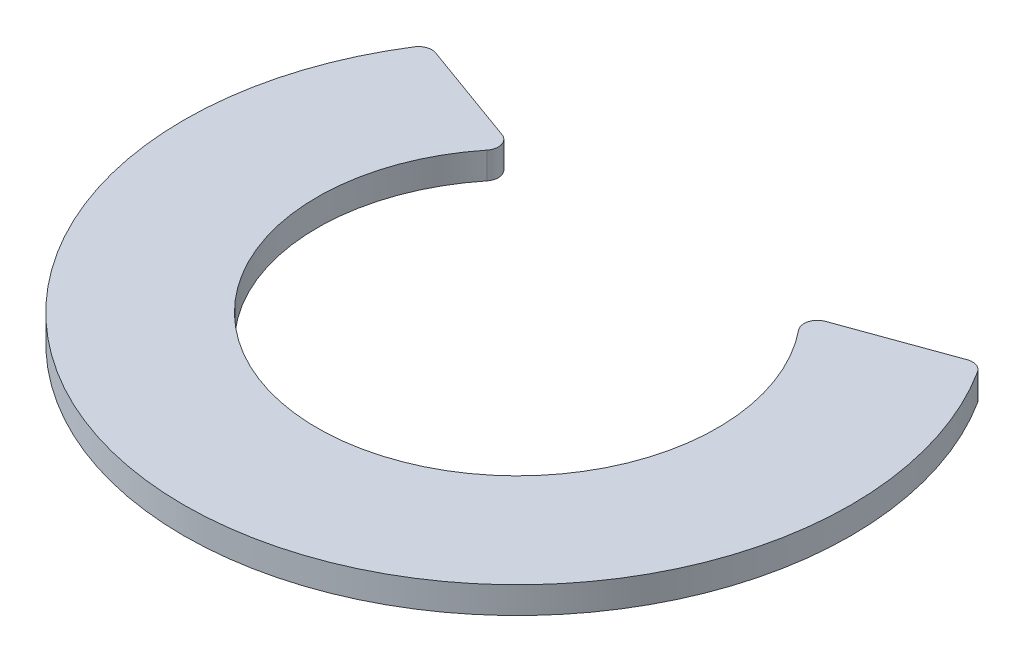
ISO-10303-21;
HEADER;
FILE_DESCRIPTION(('STEP AP214'),'2;1');
FILE_NAME('part.step','',(''),(''),'','','');
FILE_SCHEMA(('AUTOMOTIVE_DESIGN { 1 0 10303 214 1 1 1 1 }'));
ENDSEC;
DATA;
#1=APPLICATION_CONTEXT('core data for automotive mechanical design processes');
#2=APPLICATION_PROTOCOL_DEFINITION('international standard','automotive_design',2000,#1);
#3=PRODUCT_CONTEXT('',#1,'mechanical');
#4=PRODUCT('Part','Part','',(#3));
#5=PRODUCT_RELATED_PRODUCT_CATEGORY('part','',(#4));
#6=PRODUCT_DEFINITION_FORMATION('','',#4);
#7=PRODUCT_DEFINITION_CONTEXT('part definition',#1,'design');
#8=PRODUCT_DEFINITION('design','',#6,#7);
#9=PRODUCT_DEFINITION_SHAPE('','',#8);
#10=(LENGTH_UNIT() NAMED_UNIT(*) SI_UNIT(.MILLI.,.METRE.));
#11=(NAMED_UNIT(*) PLANE_ANGLE_UNIT() SI_UNIT($,.RADIAN.));
#12=(NAMED_UNIT(*) SI_UNIT($,.STERADIAN.) SOLID_ANGLE_UNIT());
#13=UNCERTAINTY_MEASURE_WITH_UNIT(LENGTH_MEASURE(1.E-05),#10,'distance_accuracy_value','');
#14=(GEOMETRIC_REPRESENTATION_CONTEXT(3) GLOBAL_UNCERTAINTY_ASSIGNED_CONTEXT((#13)) GLOBAL_UNIT_ASSIGNED_CONTEXT((#10,
#11,#12)) REPRESENTATION_CONTEXT('',''));
#15=CARTESIAN_POINT('',(0.,0.,0.));
#16=DIRECTION('',(0.,0.,1.));
#17=DIRECTION('',(1.,0.,0.));
#18=AXIS2_PLACEMENT_3D('',#15,#16,#17);
#19=CARTESIAN_POINT('',(2.02653906521966,0.2,-1.28574469360703));
#20=DIRECTION('',(0.,-1.,0.));
#21=DIRECTION('',(0.,0.,-1.));
#22=AXIS2_PLACEMENT_3D('',#19,#20,#21);
#23=CYLINDRICAL_SURFACE('',#22,0.0999999999999998);
#24=CARTESIAN_POINT('',(2.02653906521966,0.,-1.28574469360703));
#25=DIRECTION('',(0.,1.,0.));
#26=DIRECTION('',(0.,0.,1.));
#27=AXIS2_PLACEMENT_3D('',#24,#25,#26);
#28=CIRCLE('',#27,0.0999999999999998);
#29=CARTESIAN_POINT('',(2.11097819293715,0.,-1.33931738917399));
#30=VERTEX_POINT('',#29);
#31=CARTESIAN_POINT('',(1.99252463426726,0.,-1.37978201857421));
#32=VERTEX_POINT('',#31);
#33=EDGE_CURVE('E129',#30,#32,#28,.T.);
#34=ORIENTED_EDGE('',*,*,#33,.T.);
#35=DIRECTION('',(0.,-1.,0.));
#36=VECTOR('',#35,1.);
#37=CARTESIAN_POINT('',(1.99252463426726,0.2,-1.37978201857421));
#38=LINE('',#37,#36);
#39=CARTESIAN_POINT('',(1.99252463426726,0.2,-1.37978201857421));
#40=VERTEX_POINT('',#39);
#41=EDGE_CURVE('E11',#40,#32,#38,.T.);
#42=ORIENTED_EDGE('',*,*,#41,.F.);
#43=CARTESIAN_POINT('',(2.02653906521966,0.2,-1.28574469360703));
#44=DIRECTION('',(0.,1.,0.));
#45=DIRECTION('',(0.,0.,1.));
#46=AXIS2_PLACEMENT_3D('',#43,#44,#45);
#47=CIRCLE('',#46,0.0999999999999998);
#48=CARTESIAN_POINT('',(2.11097819293715,0.2,-1.33931738917399));
#49=VERTEX_POINT('',#48);
#50=EDGE_CURVE('E143',#49,#40,#47,.T.);
#51=ORIENTED_EDGE('',*,*,#50,.F.);
#52=DIRECTION('',(0.,-1.,0.));
#53=VECTOR('',#52,1.);
#54=CARTESIAN_POINT('',(2.11097819293715,0.2,-1.33931738917399));
#55=LINE('',#54,#53);
#56=EDGE_CURVE('E125',#49,#30,#55,.T.);
#57=ORIENTED_EDGE('',*,*,#56,.T.);
#58=EDGE_LOOP('',(#34,#42,#51,#57));
#59=FACE_BOUND('',#58,.T.);
#60=ADVANCED_FACE('F33',(#59),#23,.T.);
#61=CARTESIAN_POINT('',(1.21218558709129,0.2,-1.09752400401574));
#62=DIRECTION('',(0.340144309523994,0.,0.940373249671876));
#63=DIRECTION('',(0.940373249671877,0.,-0.340144309523994));
#64=AXIS2_PLACEMENT_3D('',#61,#62,#63);
#65=PLANE('',#64);
#66=DIRECTION('',(-0.940373249671876,0.,0.340144309523994));
#67=VECTOR('',#66,1.);
#68=CARTESIAN_POINT('',(1.21218558709129,0.,-1.09752400401574));
#69=LINE('',#68,#67);
#70=CARTESIAN_POINT('',(1.21218558709129,0.,-1.09752400401574));
#71=VERTEX_POINT('',#70);
#72=EDGE_CURVE('E132',#32,#71,#69,.T.);
#73=ORIENTED_EDGE('',*,*,#72,.T.);
#74=DIRECTION('',(0.,-1.,0.));
#75=VECTOR('',#74,1.);
#76=CARTESIAN_POINT('',(1.21218558709129,0.2,-1.09752400401574));
#77=LINE('',#76,#75);
#78=CARTESIAN_POINT('',(1.21218558709129,0.2,-1.09752400401574));
#79=VERTEX_POINT('',#78);
#80=EDGE_CURVE('E41',#79,#71,#77,.T.);
#81=ORIENTED_EDGE('',*,*,#80,.F.);
#82=DIRECTION('',(-0.940373249671876,0.,0.340144309523994));
#83=VECTOR('',#82,1.);
#84=CARTESIAN_POINT('',(1.21218558709129,0.2,-1.09752400401574));
#85=LINE('',#84,#83);
#86=EDGE_CURVE('E92',#40,#79,#85,.T.);
#87=ORIENTED_EDGE('',*,*,#86,.F.);
#88=ORIENTED_EDGE('',*,*,#41,.T.);
#89=EDGE_LOOP('',(#73,#81,#87,#88));
#90=FACE_BOUND('',#89,.T.);
#91=ADVANCED_FACE('F178',(#90),#65,.F.);
#92=CARTESIAN_POINT('',(1.24620001804369,0.2,-1.00348667904856));
#93=DIRECTION('',(0.,-1.,0.));
#94=DIRECTION('',(0.,0.,-1.));
#95=AXIS2_PLACEMENT_3D('',#92,#93,#94);
#96=CYLINDRICAL_SURFACE('',#95,0.0999999999999999);
#97=CARTESIAN_POINT('',(1.24620001804369,0.,-1.00348667904856));
#98=DIRECTION('',(0.,1.,0.));
#99=DIRECTION('',(0.,0.,-1.));
#100=AXIS2_PLACEMENT_3D('',#97,#98,#99);
#101=CIRCLE('',#100,0.0999999999999999);
#102=CARTESIAN_POINT('',(1.16831251691596,0.,-0.940768761608021));
#103=VERTEX_POINT('',#102);
#104=EDGE_CURVE('E134',#71,#103,#101,.T.);
#105=ORIENTED_EDGE('',*,*,#104,.T.);
#106=DIRECTION('',(0.,-1.,0.));
#107=VECTOR('',#106,1.);
#108=CARTESIAN_POINT('',(1.16831251691596,0.2,-0.940768761608021));
#109=LINE('',#108,#107);
#110=CARTESIAN_POINT('',(1.16831251691596,0.2,-0.940768761608021));
#111=VERTEX_POINT('',#110);
#112=EDGE_CURVE('E150',#111,#103,#109,.T.);
#113=ORIENTED_EDGE('',*,*,#112,.F.);
#114=CARTESIAN_POINT('',(1.24620001804369,0.2,-1.00348667904856));
#115=DIRECTION('',(0.,1.,0.));
#116=DIRECTION('',(0.,0.,-1.));
#117=AXIS2_PLACEMENT_3D('',#114,#115,#116);
#118=CIRCLE('',#117,0.0999999999999999);
#119=EDGE_CURVE('E158',#79,#111,#118,.T.);
#120=ORIENTED_EDGE('',*,*,#119,.F.);
#121=ORIENTED_EDGE('',*,*,#80,.T.);
#122=EDGE_LOOP('',(#105,#113,#120,#121));
#123=FACE_BOUND('',#122,.T.);
#124=ADVANCED_FACE('F156',(#123),#96,.T.);
#125=CARTESIAN_POINT('',(0.,0.2,0.));
#126=DIRECTION('',(0.,-1.,0.));
#127=DIRECTION('',(0.,0.,-1.));
#128=AXIS2_PLACEMENT_3D('',#125,#126,#127);
#129=CYLINDRICAL_SURFACE('',#128,1.5);
#130=CARTESIAN_POINT('',(0.,0.,0.));
#131=DIRECTION('',(0.,-1.,0.));
#132=DIRECTION('',(0.,0.,1.));
#133=AXIS2_PLACEMENT_3D('',#130,#131,#132);
#134=CIRCLE('',#133,1.5);
#135=CARTESIAN_POINT('',(-1.16831251691596,0.,-0.940768761608022));
#136=VERTEX_POINT('',#135);
#137=EDGE_CURVE('E136',#103,#136,#134,.T.);
#138=ORIENTED_EDGE('',*,*,#137,.T.);
#139=DIRECTION('',(0.,-1.,0.));
#140=VECTOR('',#139,1.);
#141=CARTESIAN_POINT('',(-1.16831251691596,0.2,-0.940768761608022));
#142=LINE('',#141,#140);
#143=CARTESIAN_POINT('',(-1.16831251691596,0.2,-0.940768761608022));
#144=VERTEX_POINT('',#143);
#145=EDGE_CURVE('E147',#144,#136,#142,.T.);
#146=ORIENTED_EDGE('',*,*,#145,.F.);
#147=CARTESIAN_POINT('',(0.,0.2,0.));
#148=DIRECTION('',(0.,-1.,0.));
#149=DIRECTION('',(0.,0.,1.));
#150=AXIS2_PLACEMENT_3D('',#147,#148,#149);
#151=CIRCLE('',#150,1.5);
#152=EDGE_CURVE('E170',#111,#144,#151,.T.);
#153=ORIENTED_EDGE('',*,*,#152,.F.);
#154=ORIENTED_EDGE('',*,*,#112,.T.);
#155=EDGE_LOOP('',(#138,#146,#153,#154));
#156=FACE_BOUND('',#155,.T.);
#157=ADVANCED_FACE('F166',(#156),#129,.F.);
#158=CARTESIAN_POINT('',(-1.24620001804369,0.2,-1.00348667904856));
#159=DIRECTION('',(0.,-1.,0.));
#160=DIRECTION('',(0.,0.,-1.));
#161=AXIS2_PLACEMENT_3D('',#158,#159,#160);
#162=CYLINDRICAL_SURFACE('',#161,0.1);
#163=CARTESIAN_POINT('',(-1.24620001804369,0.,-1.00348667904856));
#164=DIRECTION('',(0.,1.,0.));
#165=DIRECTION('',(0.,0.,1.));
#166=AXIS2_PLACEMENT_3D('',#163,#164,#165);
#167=CIRCLE('',#166,0.1);
#168=CARTESIAN_POINT('',(-1.21218558709129,0.,-1.09752400401574));
#169=VERTEX_POINT('',#168);
#170=EDGE_CURVE('E138',#136,#169,#167,.T.);
#171=ORIENTED_EDGE('',*,*,#170,.T.);
#172=DIRECTION('',(0.,-1.,0.));
#173=VECTOR('',#172,1.);
#174=CARTESIAN_POINT('',(-1.21218558709129,0.2,-1.09752400401574));
#175=LINE('',#174,#173);
#176=CARTESIAN_POINT('',(-1.21218558709129,0.2,-1.09752400401574));
#177=VERTEX_POINT('',#176);
#178=EDGE_CURVE('E120',#177,#169,#175,.T.);
#179=ORIENTED_EDGE('',*,*,#178,.F.);
#180=CARTESIAN_POINT('',(-1.24620001804369,0.2,-1.00348667904856));
#181=DIRECTION('',(0.,1.,0.));
#182=DIRECTION('',(0.,0.,1.));
#183=AXIS2_PLACEMENT_3D('',#180,#181,#182);
#184=CIRCLE('',#183,0.1);
#185=EDGE_CURVE('E111',#144,#177,#184,.T.);
#186=ORIENTED_EDGE('',*,*,#185,.F.);
#187=ORIENTED_EDGE('',*,*,#145,.T.);
#188=EDGE_LOOP('',(#171,#179,#186,#187));
#189=FACE_BOUND('',#188,.T.);
#190=ADVANCED_FACE('F169',(#189),#162,.T.);
#191=CARTESIAN_POINT('',(-1.99252463426726,0.2,-1.37978201857422));
#192=DIRECTION('',(-0.340144309523994,0.,0.940373249671876));
#193=DIRECTION('',(0.940373249671877,0.,0.340144309523994));
#194=AXIS2_PLACEMENT_3D('',#191,#192,#193);
#195=PLANE('',#194);
#196=DIRECTION('',(-0.940373249671876,0.,-0.340144309523994));
#197=VECTOR('',#196,1.);
#198=CARTESIAN_POINT('',(-1.99252463426726,0.,-1.37978201857422));
#199=LINE('',#198,#197);
#200=CARTESIAN_POINT('',(-1.99252463426726,0.,-1.37978201857421));
#201=VERTEX_POINT('',#200);
#202=EDGE_CURVE('E119',#169,#201,#199,.T.);
#203=ORIENTED_EDGE('',*,*,#202,.T.);
#204=DIRECTION('',(0.,-1.,0.));
#205=VECTOR('',#204,1.);
#206=CARTESIAN_POINT('',(-1.99252463426726,0.2,-1.37978201857421));
#207=LINE('',#206,#205);
#208=CARTESIAN_POINT('',(-1.99252463426726,0.2,-1.37978201857421));
#209=VERTEX_POINT('',#208);
#210=EDGE_CURVE('E116',#209,#201,#207,.T.);
#211=ORIENTED_EDGE('',*,*,#210,.F.);
#212=DIRECTION('',(-0.940373249671876,0.,-0.340144309523994));
#213=VECTOR('',#212,1.);
#214=CARTESIAN_POINT('',(-1.99252463426726,0.2,-1.37978201857422));
#215=LINE('',#214,#213);
#216=EDGE_CURVE('E105',#177,#209,#215,.T.);
#217=ORIENTED_EDGE('',*,*,#216,.F.);
#218=ORIENTED_EDGE('',*,*,#178,.T.);
#219=EDGE_LOOP('',(#203,#211,#217,#218));
#220=FACE_BOUND('',#219,.T.);
#221=ADVANCED_FACE('F117',(#220),#195,.F.);
#222=CARTESIAN_POINT('',(-2.02653906521966,0.2,-1.28574469360703));
#223=DIRECTION('',(0.,-1.,0.));
#224=DIRECTION('',(0.,0.,-1.));
#225=AXIS2_PLACEMENT_3D('',#222,#223,#224);
#226=CYLINDRICAL_SURFACE('',#225,0.0999999999999997);
#227=CARTESIAN_POINT('',(-2.02653906521966,0.,-1.28574469360703));
#228=DIRECTION('',(0.,1.,0.));
#229=DIRECTION('',(0.,0.,-1.));
#230=AXIS2_PLACEMENT_3D('',#227,#228,#229);
#231=CIRCLE('',#230,0.0999999999999997);
#232=CARTESIAN_POINT('',(-2.11097819293715,0.,-1.33931738917399));
#233=VERTEX_POINT('',#232);
#234=EDGE_CURVE('E78',#201,#233,#231,.T.);
#235=ORIENTED_EDGE('',*,*,#234,.T.);
#236=DIRECTION('',(0.,-1.,0.));
#237=VECTOR('',#236,1.);
#238=CARTESIAN_POINT('',(-2.11097819293715,0.2,-1.33931738917399));
#239=LINE('',#238,#237);
#240=CARTESIAN_POINT('',(-2.11097819293715,0.2,-1.33931738917399));
#241=VERTEX_POINT('',#240);
#242=EDGE_CURVE('E121',#241,#233,#239,.T.);
#243=ORIENTED_EDGE('',*,*,#242,.F.);
#244=CARTESIAN_POINT('',(-2.02653906521966,0.2,-1.28574469360703));
#245=DIRECTION('',(0.,1.,0.));
#246=DIRECTION('',(0.,0.,-1.));
#247=AXIS2_PLACEMENT_3D('',#244,#245,#246);
#248=CIRCLE('',#247,0.0999999999999997);
#249=EDGE_CURVE('E109',#209,#241,#248,.T.);
#250=ORIENTED_EDGE('',*,*,#249,.F.);
#251=ORIENTED_EDGE('',*,*,#210,.T.);
#252=EDGE_LOOP('',(#235,#243,#250,#251));
#253=FACE_BOUND('',#252,.T.);
#254=ADVANCED_FACE('F123',(#253),#226,.T.);
#255=CARTESIAN_POINT('',(0.,0.2,0.));
#256=DIRECTION('',(0.,-1.,0.));
#257=DIRECTION('',(0.,0.,-1.));
#258=AXIS2_PLACEMENT_3D('',#255,#256,#257);
#259=CYLINDRICAL_SURFACE('',#258,2.5);
#260=CARTESIAN_POINT('',(0.,0.,0.));
#261=DIRECTION('',(0.,1.,0.));
#262=DIRECTION('',(0.,0.,1.));
#263=AXIS2_PLACEMENT_3D('',#260,#261,#262);
#264=CIRCLE('',#263,2.5);
#265=EDGE_CURVE('E84',#233,#30,#264,.T.);
#266=ORIENTED_EDGE('',*,*,#265,.T.);
#267=ORIENTED_EDGE('',*,*,#56,.F.);
#268=CARTESIAN_POINT('',(0.,0.2,0.));
#269=DIRECTION('',(0.,1.,0.));
#270=DIRECTION('',(0.,0.,1.));
#271=AXIS2_PLACEMENT_3D('',#268,#269,#270);
#272=CIRCLE('',#271,2.5);
#273=EDGE_CURVE('E49',#241,#49,#272,.T.);
#274=ORIENTED_EDGE('',*,*,#273,.F.);
#275=ORIENTED_EDGE('',*,*,#242,.T.);
#276=EDGE_LOOP('',(#266,#267,#274,#275));
#277=FACE_BOUND('',#276,.T.);
#278=ADVANCED_FACE('F194',(#277),#259,.T.);
#279=CARTESIAN_POINT('',(2.02653906521966,0.2,-1.28574469360703));
#280=DIRECTION('',(0.,1.,0.));
#281=DIRECTION('',(0.,0.,1.));
#282=AXIS2_PLACEMENT_3D('',#279,#280,#281);
#283=PLANE('',#282);
#284=ORIENTED_EDGE('',*,*,#50,.T.);
#285=ORIENTED_EDGE('',*,*,#86,.T.);
#286=ORIENTED_EDGE('',*,*,#119,.T.);
#287=ORIENTED_EDGE('',*,*,#152,.T.);
#288=ORIENTED_EDGE('',*,*,#185,.T.);
#289=ORIENTED_EDGE('',*,*,#216,.T.);
#290=ORIENTED_EDGE('',*,*,#249,.T.);
#291=ORIENTED_EDGE('',*,*,#273,.T.);
#292=EDGE_LOOP('',(#284,#285,#286,#287,#288,#289,#290,#291));
#293=FACE_BOUND('',#292,.T.);
#294=ADVANCED_FACE('F107',(#293),#283,.T.);
#295=CARTESIAN_POINT('',(2.02653906521966,0.,-1.28574469360703));
#296=DIRECTION('',(0.,1.,0.));
#297=DIRECTION('',(0.,0.,1.));
#298=AXIS2_PLACEMENT_3D('',#295,#296,#297);
#299=PLANE('',#298);
#300=ORIENTED_EDGE('',*,*,#33,.F.);
#301=ORIENTED_EDGE('',*,*,#265,.F.);
#302=ORIENTED_EDGE('',*,*,#234,.F.);
#303=ORIENTED_EDGE('',*,*,#202,.F.);
#304=ORIENTED_EDGE('',*,*,#170,.F.);
#305=ORIENTED_EDGE('',*,*,#137,.F.);
#306=ORIENTED_EDGE('',*,*,#104,.F.);
#307=ORIENTED_EDGE('',*,*,#72,.F.);
#308=EDGE_LOOP('',(#300,#301,#302,#303,#304,#305,#306,#307));
#309=FACE_BOUND('',#308,.T.);
#310=ADVANCED_FACE('F162',(#309),#299,.F.);
#311=CLOSED_SHELL('',(#60,#91,#124,#157,#190,#221,#254,#278,#294,#310));
#312=MANIFOLD_SOLID_BREP('B2',#311);
#313=ADVANCED_BREP_SHAPE_REPRESENTATION('',(#18,#312),#14);
#314=SHAPE_DEFINITION_REPRESENTATION(#9,#313);
ENDSEC;
END-ISO-10303-21;
